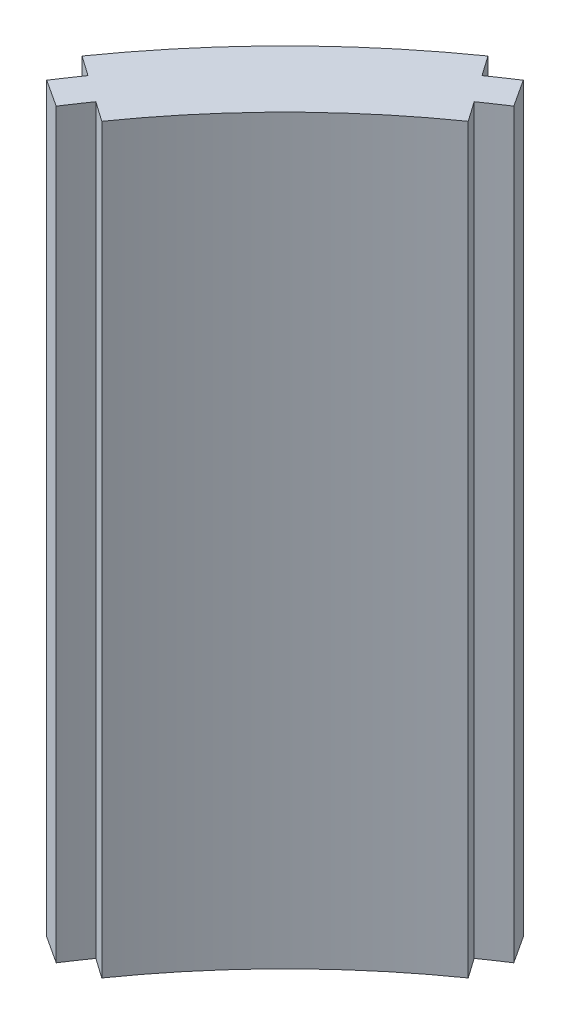
ISO-10303-21;
HEADER;
FILE_DESCRIPTION(('STEP AP214'),'2;1');
FILE_NAME('part.step','',(''),(''),'','','');
FILE_SCHEMA(('AUTOMOTIVE_DESIGN { 1 0 10303 214 1 1 1 1 }'));
ENDSEC;
DATA;
#1=APPLICATION_CONTEXT('core data for automotive mechanical design processes');
#2=APPLICATION_PROTOCOL_DEFINITION('international standard','automotive_design',2000,#1);
#3=PRODUCT_CONTEXT('',#1,'mechanical');
#4=PRODUCT('Part','Part','',(#3));
#5=PRODUCT_RELATED_PRODUCT_CATEGORY('part','',(#4));
#6=PRODUCT_DEFINITION_FORMATION('','',#4);
#7=PRODUCT_DEFINITION_CONTEXT('part definition',#1,'design');
#8=PRODUCT_DEFINITION('design','',#6,#7);
#9=PRODUCT_DEFINITION_SHAPE('','',#8);
#10=(LENGTH_UNIT() NAMED_UNIT(*) SI_UNIT(.MILLI.,.METRE.));
#11=(NAMED_UNIT(*) PLANE_ANGLE_UNIT() SI_UNIT($,.RADIAN.));
#12=(NAMED_UNIT(*) SI_UNIT($,.STERADIAN.) SOLID_ANGLE_UNIT());
#13=UNCERTAINTY_MEASURE_WITH_UNIT(LENGTH_MEASURE(1.E-05),#10,'distance_accuracy_value','');
#14=(GEOMETRIC_REPRESENTATION_CONTEXT(3) GLOBAL_UNCERTAINTY_ASSIGNED_CONTEXT((#13)) GLOBAL_UNIT_ASSIGNED_CONTEXT((#10,
#11,#12)) REPRESENTATION_CONTEXT('',''));
#15=CARTESIAN_POINT('',(0.,0.,0.));
#16=DIRECTION('',(0.,0.,1.));
#17=DIRECTION('',(1.,0.,0.));
#18=AXIS2_PLACEMENT_3D('',#15,#16,#17);
#19=CARTESIAN_POINT('',(0.,32.,0.));
#20=DIRECTION('',(0.,-1.,0.));
#21=DIRECTION('',(0.,0.,-1.));
#22=AXIS2_PLACEMENT_3D('',#19,#20,#21);
#23=CYLINDRICAL_SURFACE('',#22,36.);
#24=CARTESIAN_POINT('',(0.,0.,0.));
#25=DIRECTION('',(0.,1.,0.));
#26=DIRECTION('',(0.,0.,1.));
#27=AXIS2_PLACEMENT_3D('',#24,#25,#26);
#28=CIRCLE('',#27,36.);
#29=CARTESIAN_POINT('',(-20.7001890735579,0.,-29.4533898273009));
#30=VERTEX_POINT('',#29);
#31=CARTESIAN_POINT('',(-29.4533898273006,0.,-20.7001890735584));
#32=VERTEX_POINT('',#31);
#33=EDGE_CURVE('E159',#30,#32,#28,.T.);
#34=ORIENTED_EDGE('',*,*,#33,.T.);
#35=DIRECTION('',(0.,-1.,0.));
#36=VECTOR('',#35,1.);
#37=CARTESIAN_POINT('',(-29.4533898273006,32.,-20.7001890735584));
#38=LINE('',#37,#36);
#39=CARTESIAN_POINT('',(-29.4533898273006,32.,-20.7001890735584));
#40=VERTEX_POINT('',#39);
#41=EDGE_CURVE('E11',#40,#32,#38,.T.);
#42=ORIENTED_EDGE('',*,*,#41,.F.);
#43=CARTESIAN_POINT('',(0.,32.,0.));
#44=DIRECTION('',(0.,1.,0.));
#45=DIRECTION('',(0.,0.,1.));
#46=AXIS2_PLACEMENT_3D('',#43,#44,#45);
#47=CIRCLE('',#46,36.);
#48=CARTESIAN_POINT('',(-20.7001890735579,32.,-29.4533898273009));
#49=VERTEX_POINT('',#48);
#50=EDGE_CURVE('E181',#49,#40,#47,.T.);
#51=ORIENTED_EDGE('',*,*,#50,.F.);
#52=DIRECTION('',(0.,-1.,0.));
#53=VECTOR('',#52,1.);
#54=CARTESIAN_POINT('',(-20.7001890735579,32.,-29.4533898273009));
#55=LINE('',#54,#53);
#56=EDGE_CURVE('E155',#49,#30,#55,.T.);
#57=ORIENTED_EDGE('',*,*,#56,.T.);
#58=EDGE_LOOP('',(#34,#42,#51,#57));
#59=FACE_BOUND('',#58,.T.);
#60=ADVANCED_FACE('F39',(#59),#23,.T.);
#61=CARTESIAN_POINT('',(-29.4533898273006,32.,-20.7001890735584));
#62=DIRECTION('',(0.575005252043288,0.,-0.818149717425017));
#63=DIRECTION('',(-0.818149717425017,0.,-0.575005252043288));
#64=AXIS2_PLACEMENT_3D('',#61,#62,#63);
#65=PLANE('',#64);
#66=DIRECTION('',(0.818149717425017,0.,0.575005252043288));
#67=VECTOR('',#66,1.);
#68=CARTESIAN_POINT('',(-29.4533898273006,0.,-20.7001890735584));
#69=LINE('',#68,#67);
#70=CARTESIAN_POINT('',(-28.5943326240043,0.,-20.0964335589129));
#71=VERTEX_POINT('',#70);
#72=EDGE_CURVE('E162',#32,#71,#69,.T.);
#73=ORIENTED_EDGE('',*,*,#72,.T.);
#74=DIRECTION('',(0.,-1.,0.));
#75=VECTOR('',#74,1.);
#76=CARTESIAN_POINT('',(-28.5943326240043,32.,-20.0964335589129));
#77=LINE('',#76,#75);
#78=CARTESIAN_POINT('',(-28.5943326240043,32.,-20.0964335589129));
#79=VERTEX_POINT('',#78);
#80=EDGE_CURVE('E47',#79,#71,#77,.T.);
#81=ORIENTED_EDGE('',*,*,#80,.F.);
#82=DIRECTION('',(0.818149717425017,0.,0.575005252043288));
#83=VECTOR('',#82,1.);
#84=CARTESIAN_POINT('',(-29.4533898273006,32.,-20.7001890735584));
#85=LINE('',#84,#83);
#86=EDGE_CURVE('E110',#40,#79,#85,.T.);
#87=ORIENTED_EDGE('',*,*,#86,.F.);
#88=ORIENTED_EDGE('',*,*,#41,.T.);
#89=EDGE_LOOP('',(#73,#81,#87,#88));
#90=FACE_BOUND('',#89,.T.);
#91=ADVANCED_FACE('F259',(#90),#65,.F.);
#92=CARTESIAN_POINT('',(0.,32.,0.));
#93=DIRECTION('',(0.,-1.,0.));
#94=DIRECTION('',(0.,0.,-1.));
#95=AXIS2_PLACEMENT_3D('',#92,#93,#94);
#96=CYLINDRICAL_SURFACE('',#95,34.95);
#97=CARTESIAN_POINT('',(0.,0.,0.));
#98=DIRECTION('',(0.,1.,0.));
#99=DIRECTION('',(0.,0.,1.));
#100=AXIS2_PLACEMENT_3D('',#97,#98,#99);
#101=CIRCLE('',#100,34.95);
#102=CARTESIAN_POINT('',(-29.3115363496925,0.,-19.0351342737753));
#103=VERTEX_POINT('',#102);
#104=EDGE_CURVE('E164',#71,#103,#101,.T.);
#105=ORIENTED_EDGE('',*,*,#104,.T.);
#106=DIRECTION('',(0.,-1.,0.));
#107=VECTOR('',#106,1.);
#108=CARTESIAN_POINT('',(-29.3115363496925,32.,-19.0351342737753));
#109=LINE('',#108,#107);
#110=CARTESIAN_POINT('',(-29.3115363496925,32.,-19.0351342737753));
#111=VERTEX_POINT('',#110);
#112=EDGE_CURVE('E200',#111,#103,#109,.T.);
#113=ORIENTED_EDGE('',*,*,#112,.F.);
#114=CARTESIAN_POINT('',(0.,32.,0.));
#115=DIRECTION('',(0.,1.,0.));
#116=DIRECTION('',(0.,0.,1.));
#117=AXIS2_PLACEMENT_3D('',#114,#115,#116);
#118=CIRCLE('',#117,34.95);
#119=EDGE_CURVE('E208',#79,#111,#118,.T.);
#120=ORIENTED_EDGE('',*,*,#119,.F.);
#121=ORIENTED_EDGE('',*,*,#80,.T.);
#122=EDGE_LOOP('',(#105,#113,#120,#121));
#123=FACE_BOUND('',#122,.T.);
#124=ADVANCED_FACE('F206',(#123),#96,.T.);
#125=CARTESIAN_POINT('',(-28.1387282855958,32.,-18.2705903152966));
#126=DIRECTION('',(0.54610196101444,0.,-0.837718716620432));
#127=DIRECTION('',(-0.837718716620432,0.,-0.54610196101444));
#128=AXIS2_PLACEMENT_3D('',#125,#126,#127);
#129=PLANE('',#128);
#130=DIRECTION('',(0.837718716620432,0.,0.54610196101444));
#131=VECTOR('',#130,1.);
#132=CARTESIAN_POINT('',(-28.1387282855958,0.,-18.2705903152966));
#133=LINE('',#132,#131);
#134=CARTESIAN_POINT('',(-28.1387282855958,0.,-18.2705903152966));
#135=VERTEX_POINT('',#134);
#136=EDGE_CURVE('E166',#103,#135,#133,.T.);
#137=ORIENTED_EDGE('',*,*,#136,.T.);
#138=DIRECTION('',(0.,-1.,0.));
#139=VECTOR('',#138,1.);
#140=CARTESIAN_POINT('',(-28.1387282855958,32.,-18.2705903152966));
#141=LINE('',#140,#139);
#142=CARTESIAN_POINT('',(-28.1387282855958,32.,-18.2705903152966));
#143=VERTEX_POINT('',#142);
#144=EDGE_CURVE('E197',#143,#135,#141,.T.);
#145=ORIENTED_EDGE('',*,*,#144,.F.);
#146=DIRECTION('',(0.837718716620432,0.,0.54610196101444));
#147=VECTOR('',#146,1.);
#148=CARTESIAN_POINT('',(-28.1387282855958,32.,-18.2705903152966));
#149=LINE('',#148,#147);
#150=EDGE_CURVE('E226',#111,#143,#149,.T.);
#151=ORIENTED_EDGE('',*,*,#150,.F.);
#152=ORIENTED_EDGE('',*,*,#112,.T.);
#153=EDGE_LOOP('',(#137,#145,#151,#152));
#154=FACE_BOUND('',#153,.T.);
#155=ADVANCED_FACE('F217',(#154),#129,.F.);
#156=CARTESIAN_POINT('',(0.,32.,0.));
#157=DIRECTION('',(0.,-1.,0.));
#158=DIRECTION('',(0.,0.,-1.));
#159=AXIS2_PLACEMENT_3D('',#156,#157,#158);
#160=CYLINDRICAL_SURFACE('',#159,33.55);
#161=CARTESIAN_POINT('',(0.,0.,0.));
#162=DIRECTION('',(0.,-1.,0.));
#163=DIRECTION('',(0.,0.,1.));
#164=AXIS2_PLACEMENT_3D('',#161,#162,#163);
#165=CIRCLE('',#164,33.55);
#166=CARTESIAN_POINT('',(-27.4489230196093,0.,-19.2914262060523));
#167=VERTEX_POINT('',#166);
#168=EDGE_CURVE('E168',#135,#167,#165,.T.);
#169=ORIENTED_EDGE('',*,*,#168,.T.);
#170=DIRECTION('',(0.,-1.,0.));
#171=VECTOR('',#170,1.);
#172=CARTESIAN_POINT('',(-27.4489230196093,32.,-19.2914262060523));
#173=LINE('',#172,#171);
#174=CARTESIAN_POINT('',(-27.4489230196093,32.,-19.2914262060523));
#175=VERTEX_POINT('',#174);
#176=EDGE_CURVE('E194',#175,#167,#173,.T.);
#177=ORIENTED_EDGE('',*,*,#176,.F.);
#178=CARTESIAN_POINT('',(0.,32.,0.));
#179=DIRECTION('',(0.,-1.,0.));
#180=DIRECTION('',(0.,0.,1.));
#181=AXIS2_PLACEMENT_3D('',#178,#179,#180);
#182=CIRCLE('',#181,33.55);
#183=EDGE_CURVE('E223',#143,#175,#182,.T.);
#184=ORIENTED_EDGE('',*,*,#183,.F.);
#185=ORIENTED_EDGE('',*,*,#144,.T.);
#186=EDGE_LOOP('',(#169,#177,#184,#185));
#187=FACE_BOUND('',#186,.T.);
#188=ADVANCED_FACE('F221',(#187),#160,.F.);
#189=CARTESIAN_POINT('',(-27.4489230196093,32.,-19.2914262060523));
#190=DIRECTION('',(0.575005252043289,0.,-0.818149717425016));
#191=DIRECTION('',(-0.818149717425016,0.,-0.575005252043289));
#192=AXIS2_PLACEMENT_3D('',#189,#190,#191);
#193=PLANE('',#192);
#194=DIRECTION('',(0.818149717425016,0.,0.575005252043289));
#195=VECTOR('',#194,1.);
#196=CARTESIAN_POINT('',(-27.4489230196093,0.,-19.2914262060523));
#197=LINE('',#196,#195);
#198=CARTESIAN_POINT('',(-26.589865816313,0.,-18.6876706914069));
#199=VERTEX_POINT('',#198);
#200=EDGE_CURVE('E170',#167,#199,#197,.T.);
#201=ORIENTED_EDGE('',*,*,#200,.T.);
#202=DIRECTION('',(0.,-1.,0.));
#203=VECTOR('',#202,1.);
#204=CARTESIAN_POINT('',(-26.589865816313,32.,-18.6876706914069));
#205=LINE('',#204,#203);
#206=CARTESIAN_POINT('',(-26.589865816313,32.,-18.6876706914069));
#207=VERTEX_POINT('',#206);
#208=EDGE_CURVE('E191',#207,#199,#205,.T.);
#209=ORIENTED_EDGE('',*,*,#208,.F.);
#210=DIRECTION('',(0.818149717425016,0.,0.575005252043289));
#211=VECTOR('',#210,1.);
#212=CARTESIAN_POINT('',(-27.4489230196093,32.,-19.2914262060523));
#213=LINE('',#212,#211);
#214=EDGE_CURVE('E225',#175,#207,#213,.T.);
#215=ORIENTED_EDGE('',*,*,#214,.F.);
#216=ORIENTED_EDGE('',*,*,#176,.T.);
#217=EDGE_LOOP('',(#201,#209,#215,#216));
#218=FACE_BOUND('',#217,.T.);
#219=ADVANCED_FACE('F272',(#218),#193,.F.);
#220=CARTESIAN_POINT('',(0.,32.,0.));
#221=DIRECTION('',(0.,-1.,0.));
#222=DIRECTION('',(0.,0.,-1.));
#223=AXIS2_PLACEMENT_3D('',#220,#221,#222);
#224=CYLINDRICAL_SURFACE('',#223,32.5);
#225=CARTESIAN_POINT('',(0.,0.,0.));
#226=DIRECTION('',(0.,-1.,0.));
#227=DIRECTION('',(0.,0.,1.));
#228=AXIS2_PLACEMENT_3D('',#225,#226,#227);
#229=CIRCLE('',#228,32.5);
#230=CARTESIAN_POINT('',(-18.6876706914064,0.,-26.5898658163134));
#231=VERTEX_POINT('',#230);
#232=EDGE_CURVE('E172',#199,#231,#229,.T.);
#233=ORIENTED_EDGE('',*,*,#232,.T.);
#234=DIRECTION('',(0.,-1.,0.));
#235=VECTOR('',#234,1.);
#236=CARTESIAN_POINT('',(-18.6876706914064,32.,-26.5898658163134));
#237=LINE('',#236,#235);
#238=CARTESIAN_POINT('',(-18.6876706914064,32.,-26.5898658163134));
#239=VERTEX_POINT('',#238);
#240=EDGE_CURVE('E188',#239,#231,#237,.T.);
#241=ORIENTED_EDGE('',*,*,#240,.F.);
#242=CARTESIAN_POINT('',(0.,32.,0.));
#243=DIRECTION('',(0.,-1.,0.));
#244=DIRECTION('',(0.,0.,1.));
#245=AXIS2_PLACEMENT_3D('',#242,#243,#244);
#246=CIRCLE('',#245,32.5);
#247=EDGE_CURVE('E228',#207,#239,#246,.T.);
#248=ORIENTED_EDGE('',*,*,#247,.F.);
#249=ORIENTED_EDGE('',*,*,#208,.T.);
#250=EDGE_LOOP('',(#233,#241,#248,#249));
#251=FACE_BOUND('',#250,.T.);
#252=ADVANCED_FACE('F275',(#251),#224,.F.);
#253=CARTESIAN_POINT('',(-19.2914262060518,32.,-27.4489230196096));
#254=DIRECTION('',(-0.818149717425022,0.,0.575005252043281));
#255=DIRECTION('',(0.575005252043281,0.,0.818149717425022));
#256=AXIS2_PLACEMENT_3D('',#253,#254,#255);
#257=PLANE('',#256);
#258=DIRECTION('',(-0.575005252043281,0.,-0.818149717425022));
#259=VECTOR('',#258,1.);
#260=CARTESIAN_POINT('',(-19.2914262060518,0.,-27.4489230196096));
#261=LINE('',#260,#259);
#262=CARTESIAN_POINT('',(-19.2914262060518,0.,-27.4489230196096));
#263=VERTEX_POINT('',#262);
#264=EDGE_CURVE('E174',#231,#263,#261,.T.);
#265=ORIENTED_EDGE('',*,*,#264,.T.);
#266=DIRECTION('',(0.,-1.,0.));
#267=VECTOR('',#266,1.);
#268=CARTESIAN_POINT('',(-19.2914262060518,32.,-27.4489230196096));
#269=LINE('',#268,#267);
#270=CARTESIAN_POINT('',(-19.2914262060518,32.,-27.4489230196096));
#271=VERTEX_POINT('',#270);
#272=EDGE_CURVE('E185',#271,#263,#269,.T.);
#273=ORIENTED_EDGE('',*,*,#272,.F.);
#274=DIRECTION('',(-0.575005252043281,0.,-0.818149717425022));
#275=VECTOR('',#274,1.);
#276=CARTESIAN_POINT('',(-19.2914262060518,32.,-27.4489230196096));
#277=LINE('',#276,#275);
#278=EDGE_CURVE('E234',#239,#271,#277,.T.);
#279=ORIENTED_EDGE('',*,*,#278,.F.);
#280=ORIENTED_EDGE('',*,*,#240,.T.);
#281=EDGE_LOOP('',(#265,#273,#279,#280));
#282=FACE_BOUND('',#281,.T.);
#283=ADVANCED_FACE('F240',(#282),#257,.F.);
#284=CARTESIAN_POINT('',(0.,32.,0.));
#285=DIRECTION('',(0.,-1.,0.));
#286=DIRECTION('',(0.,0.,-1.));
#287=AXIS2_PLACEMENT_3D('',#284,#285,#286);
#288=CYLINDRICAL_SURFACE('',#287,33.55);
#289=CARTESIAN_POINT('',(0.,0.,0.));
#290=DIRECTION('',(0.,-1.,0.));
#291=DIRECTION('',(0.,0.,1.));
#292=AXIS2_PLACEMENT_3D('',#289,#290,#291);
#293=CIRCLE('',#292,33.55);
#294=CARTESIAN_POINT('',(-18.2705903152963,0.,-28.138728285596));
#295=VERTEX_POINT('',#294);
#296=EDGE_CURVE('E176',#263,#295,#293,.T.);
#297=ORIENTED_EDGE('',*,*,#296,.T.);
#298=DIRECTION('',(0.,-1.,0.));
#299=VECTOR('',#298,1.);
#300=CARTESIAN_POINT('',(-18.2705903152963,32.,-28.138728285596));
#301=LINE('',#300,#299);
#302=CARTESIAN_POINT('',(-18.2705903152963,32.,-28.138728285596));
#303=VERTEX_POINT('',#302);
#304=EDGE_CURVE('E150',#303,#295,#301,.T.);
#305=ORIENTED_EDGE('',*,*,#304,.F.);
#306=CARTESIAN_POINT('',(0.,32.,0.));
#307=DIRECTION('',(0.,-1.,0.));
#308=DIRECTION('',(0.,0.,1.));
#309=AXIS2_PLACEMENT_3D('',#306,#307,#308);
#310=CIRCLE('',#309,33.55);
#311=EDGE_CURVE('E141',#271,#303,#310,.T.);
#312=ORIENTED_EDGE('',*,*,#311,.F.);
#313=ORIENTED_EDGE('',*,*,#272,.T.);
#314=EDGE_LOOP('',(#297,#305,#312,#313));
#315=FACE_BOUND('',#314,.T.);
#316=ADVANCED_FACE('F244',(#315),#288,.F.);
#317=CARTESIAN_POINT('',(-18.2705903152963,32.,-28.138728285596));
#318=DIRECTION('',(-0.837718716620447,0.,0.546101961014417));
#319=DIRECTION('',(0.546101961014417,0.,0.837718716620447));
#320=AXIS2_PLACEMENT_3D('',#317,#318,#319);
#321=PLANE('',#320);
#322=DIRECTION('',(-0.546101961014417,0.,-0.837718716620447));
#323=VECTOR('',#322,1.);
#324=CARTESIAN_POINT('',(-18.2705903152963,0.,-28.138728285596));
#325=LINE('',#324,#323);
#326=CARTESIAN_POINT('',(-19.035134273775,0.,-29.3115363496927));
#327=VERTEX_POINT('',#326);
#328=EDGE_CURVE('E149',#295,#327,#325,.T.);
#329=ORIENTED_EDGE('',*,*,#328,.T.);
#330=DIRECTION('',(0.,-1.,0.));
#331=VECTOR('',#330,1.);
#332=CARTESIAN_POINT('',(-19.035134273775,32.,-29.3115363496927));
#333=LINE('',#332,#331);
#334=CARTESIAN_POINT('',(-19.035134273775,32.,-29.3115363496927));
#335=VERTEX_POINT('',#334);
#336=EDGE_CURVE('E146',#335,#327,#333,.T.);
#337=ORIENTED_EDGE('',*,*,#336,.F.);
#338=DIRECTION('',(-0.546101961014417,0.,-0.837718716620447));
#339=VECTOR('',#338,1.);
#340=CARTESIAN_POINT('',(-18.2705903152963,32.,-28.138728285596));
#341=LINE('',#340,#339);
#342=EDGE_CURVE('E135',#303,#335,#341,.T.);
#343=ORIENTED_EDGE('',*,*,#342,.F.);
#344=ORIENTED_EDGE('',*,*,#304,.T.);
#345=EDGE_LOOP('',(#329,#337,#343,#344));
#346=FACE_BOUND('',#345,.T.);
#347=ADVANCED_FACE('F147',(#346),#321,.F.);
#348=CARTESIAN_POINT('',(0.,32.,0.));
#349=DIRECTION('',(0.,-1.,0.));
#350=DIRECTION('',(0.,0.,-1.));
#351=AXIS2_PLACEMENT_3D('',#348,#349,#350);
#352=CYLINDRICAL_SURFACE('',#351,34.95);
#353=CARTESIAN_POINT('',(0.,0.,0.));
#354=DIRECTION('',(0.,1.,0.));
#355=DIRECTION('',(0.,0.,1.));
#356=AXIS2_PLACEMENT_3D('',#353,#354,#355);
#357=CIRCLE('',#356,34.95);
#358=CARTESIAN_POINT('',(-20.0964335589124,0.,-28.5943326240047));
#359=VERTEX_POINT('',#358);
#360=EDGE_CURVE('E96',#327,#359,#357,.T.);
#361=ORIENTED_EDGE('',*,*,#360,.T.);
#362=DIRECTION('',(0.,-1.,0.));
#363=VECTOR('',#362,1.);
#364=CARTESIAN_POINT('',(-20.0964335589124,32.,-28.5943326240047));
#365=LINE('',#364,#363);
#366=CARTESIAN_POINT('',(-20.0964335589124,32.,-28.5943326240047));
#367=VERTEX_POINT('',#366);
#368=EDGE_CURVE('E151',#367,#359,#365,.T.);
#369=ORIENTED_EDGE('',*,*,#368,.F.);
#370=CARTESIAN_POINT('',(0.,32.,0.));
#371=DIRECTION('',(0.,1.,0.));
#372=DIRECTION('',(0.,0.,1.));
#373=AXIS2_PLACEMENT_3D('',#370,#371,#372);
#374=CIRCLE('',#373,34.95);
#375=EDGE_CURVE('E139',#335,#367,#374,.T.);
#376=ORIENTED_EDGE('',*,*,#375,.F.);
#377=ORIENTED_EDGE('',*,*,#336,.T.);
#378=EDGE_LOOP('',(#361,#369,#376,#377));
#379=FACE_BOUND('',#378,.T.);
#380=ADVANCED_FACE('F153',(#379),#352,.T.);
#381=CARTESIAN_POINT('',(-20.7001890735579,32.,-29.4533898273009));
#382=DIRECTION('',(-0.818149717425027,0.,0.575005252043274));
#383=DIRECTION('',(0.575005252043274,0.,0.818149717425027));
#384=AXIS2_PLACEMENT_3D('',#381,#382,#383);
#385=PLANE('',#384);
#386=DIRECTION('',(-0.575005252043274,0.,-0.818149717425027));
#387=VECTOR('',#386,1.);
#388=CARTESIAN_POINT('',(-20.7001890735579,0.,-29.4533898273009));
#389=LINE('',#388,#387);
#390=EDGE_CURVE('E102',#359,#30,#389,.T.);
#391=ORIENTED_EDGE('',*,*,#390,.T.);
#392=ORIENTED_EDGE('',*,*,#56,.F.);
#393=DIRECTION('',(-0.575005252043274,0.,-0.818149717425027));
#394=VECTOR('',#393,1.);
#395=CARTESIAN_POINT('',(-20.7001890735579,32.,-29.4533898273009));
#396=LINE('',#395,#394);
#397=EDGE_CURVE('E55',#367,#49,#396,.T.);
#398=ORIENTED_EDGE('',*,*,#397,.F.);
#399=ORIENTED_EDGE('',*,*,#368,.T.);
#400=EDGE_LOOP('',(#391,#392,#398,#399));
#401=FACE_BOUND('',#400,.T.);
#402=ADVANCED_FACE('F248',(#401),#385,.F.);
#403=CARTESIAN_POINT('',(0.,32.,0.));
#404=DIRECTION('',(0.,1.,0.));
#405=DIRECTION('',(0.,0.,1.));
#406=AXIS2_PLACEMENT_3D('',#403,#404,#405);
#407=PLANE('',#406);
#408=ORIENTED_EDGE('',*,*,#50,.T.);
#409=ORIENTED_EDGE('',*,*,#86,.T.);
#410=ORIENTED_EDGE('',*,*,#119,.T.);
#411=ORIENTED_EDGE('',*,*,#150,.T.);
#412=ORIENTED_EDGE('',*,*,#183,.T.);
#413=ORIENTED_EDGE('',*,*,#214,.T.);
#414=ORIENTED_EDGE('',*,*,#247,.T.);
#415=ORIENTED_EDGE('',*,*,#278,.T.);
#416=ORIENTED_EDGE('',*,*,#311,.T.);
#417=ORIENTED_EDGE('',*,*,#342,.T.);
#418=ORIENTED_EDGE('',*,*,#375,.T.);
#419=ORIENTED_EDGE('',*,*,#397,.T.);
#420=EDGE_LOOP('',(#408,#409,#410,#411,#412,#413,#414,#415,#416,#417,#418,#419));
#421=FACE_BOUND('',#420,.T.);
#422=ADVANCED_FACE('F137',(#421),#407,.T.);
#423=CARTESIAN_POINT('',(0.,0.,0.));
#424=DIRECTION('',(0.,1.,0.));
#425=DIRECTION('',(0.,0.,1.));
#426=AXIS2_PLACEMENT_3D('',#423,#424,#425);
#427=PLANE('',#426);
#428=ORIENTED_EDGE('',*,*,#33,.F.);
#429=ORIENTED_EDGE('',*,*,#390,.F.);
#430=ORIENTED_EDGE('',*,*,#360,.F.);
#431=ORIENTED_EDGE('',*,*,#328,.F.);
#432=ORIENTED_EDGE('',*,*,#296,.F.);
#433=ORIENTED_EDGE('',*,*,#264,.F.);
#434=ORIENTED_EDGE('',*,*,#232,.F.);
#435=ORIENTED_EDGE('',*,*,#200,.F.);
#436=ORIENTED_EDGE('',*,*,#168,.F.);
#437=ORIENTED_EDGE('',*,*,#136,.F.);
#438=ORIENTED_EDGE('',*,*,#104,.F.);
#439=ORIENTED_EDGE('',*,*,#72,.F.);
#440=EDGE_LOOP('',(#428,#429,#430,#431,#432,#433,#434,#435,#436,#437,#438,#439));
#441=FACE_BOUND('',#440,.T.);
#442=ADVANCED_FACE('F212',(#441),#427,.F.);
#443=CLOSED_SHELL('',(#60,#91,#124,#155,#188,#219,#252,#283,#316,#347,#380,#402,#422,#442));
#444=MANIFOLD_SOLID_BREP('B2',#443);
#445=ADVANCED_BREP_SHAPE_REPRESENTATION('',(#18,#444),#14);
#446=SHAPE_DEFINITION_REPRESENTATION(#9,#445);
ENDSEC;
END-ISO-10303-21;
